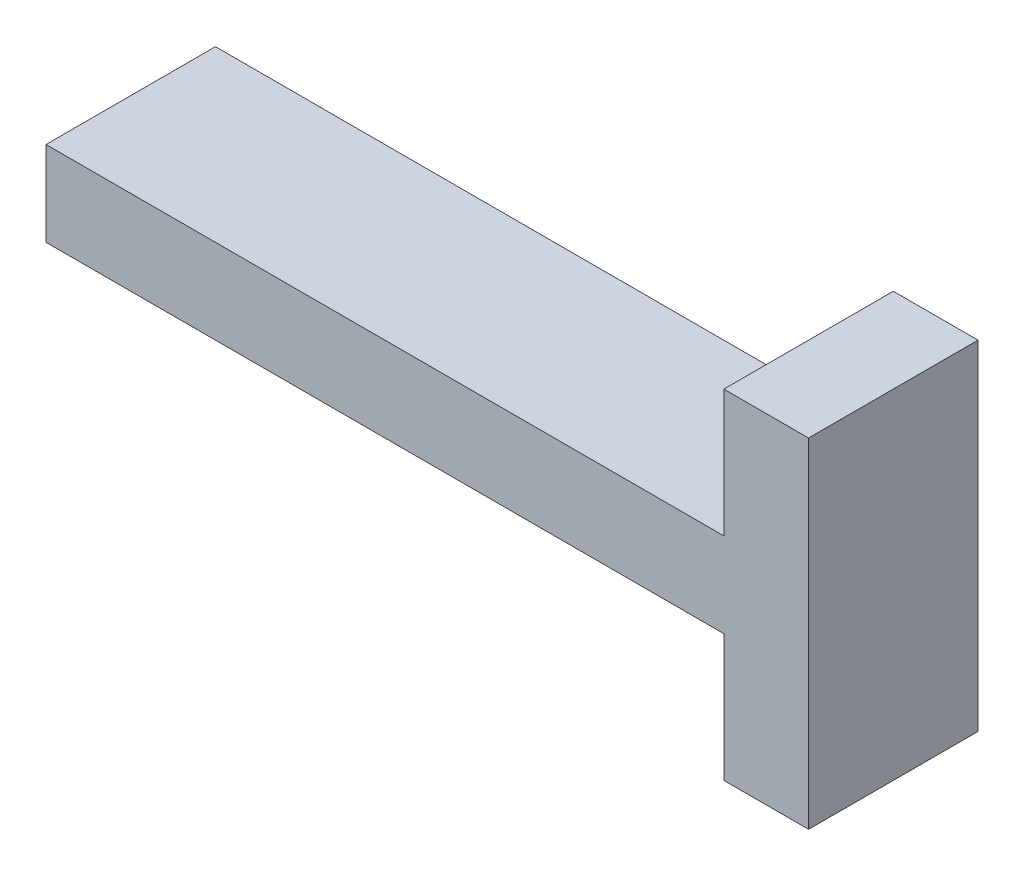
ISO-10303-21;
HEADER;
FILE_DESCRIPTION(('STEP AP214'),'2;1');
FILE_NAME('part.step','',(''),(''),'','','');
FILE_SCHEMA(('AUTOMOTIVE_DESIGN { 1 0 10303 214 1 1 1 1 }'));
ENDSEC;
DATA;
#1=APPLICATION_CONTEXT('core data for automotive mechanical design processes');
#2=APPLICATION_PROTOCOL_DEFINITION('international standard','automotive_design',2000,#1);
#3=PRODUCT_CONTEXT('',#1,'mechanical');
#4=PRODUCT('Part','Part','',(#3));
#5=PRODUCT_RELATED_PRODUCT_CATEGORY('part','',(#4));
#6=PRODUCT_DEFINITION_FORMATION('','',#4);
#7=PRODUCT_DEFINITION_CONTEXT('part definition',#1,'design');
#8=PRODUCT_DEFINITION('design','',#6,#7);
#9=PRODUCT_DEFINITION_SHAPE('','',#8);
#10=(LENGTH_UNIT() NAMED_UNIT(*) SI_UNIT(.MILLI.,.METRE.));
#11=(NAMED_UNIT(*) PLANE_ANGLE_UNIT() SI_UNIT($,.RADIAN.));
#12=(NAMED_UNIT(*) SI_UNIT($,.STERADIAN.) SOLID_ANGLE_UNIT());
#13=UNCERTAINTY_MEASURE_WITH_UNIT(LENGTH_MEASURE(1.E-05),#10,'distance_accuracy_value','');
#14=(GEOMETRIC_REPRESENTATION_CONTEXT(3) GLOBAL_UNCERTAINTY_ASSIGNED_CONTEXT((#13)) GLOBAL_UNIT_ASSIGNED_CONTEXT((#10,
#11,#12)) REPRESENTATION_CONTEXT('',''));
#15=CARTESIAN_POINT('',(0.,0.,0.));
#16=DIRECTION('',(0.,0.,1.));
#17=DIRECTION('',(1.,0.,0.));
#18=AXIS2_PLACEMENT_3D('',#15,#16,#17);
#19=CARTESIAN_POINT('',(-71.5892420537897,33.2885085574572,20.));
#20=DIRECTION('',(0.,-1.,0.));
#21=DIRECTION('',(1.,0.,0.));
#22=AXIS2_PLACEMENT_3D('',#19,#20,#21);
#23=PLANE('',#22);
#24=DIRECTION('',(-1.,0.,0.));
#25=VECTOR('',#24,1.);
#26=CARTESIAN_POINT('',(-71.5892420537897,33.2885085574572,0.));
#27=LINE('',#26,#25);
#28=CARTESIAN_POINT('',(-61.5892420537896,33.2885085574572,0.));
#29=VERTEX_POINT('',#28);
#30=CARTESIAN_POINT('',(-71.5892420537897,33.2885085574572,0.));
#31=VERTEX_POINT('',#30);
#32=EDGE_CURVE('E150',#29,#31,#27,.T.);
#33=ORIENTED_EDGE('',*,*,#32,.T.);
#34=DIRECTION('',(0.,0.,-1.));
#35=VECTOR('',#34,1.);
#36=CARTESIAN_POINT('',(-71.5892420537897,33.2885085574572,20.));
#37=LINE('',#36,#35);
#38=CARTESIAN_POINT('',(-71.5892420537897,33.2885085574572,20.));
#39=VERTEX_POINT('',#38);
#40=EDGE_CURVE('E12',#39,#31,#37,.T.);
#41=ORIENTED_EDGE('',*,*,#40,.F.);
#42=DIRECTION('',(-1.,0.,0.));
#43=VECTOR('',#42,1.);
#44=CARTESIAN_POINT('',(-71.5892420537897,33.2885085574572,20.));
#45=LINE('',#44,#43);
#46=CARTESIAN_POINT('',(-61.5892420537896,33.2885085574572,20.));
#47=VERTEX_POINT('',#46);
#48=EDGE_CURVE('E196',#47,#39,#45,.T.);
#49=ORIENTED_EDGE('',*,*,#48,.F.);
#50=DIRECTION('',(0.,0.,-1.));
#51=VECTOR('',#50,1.);
#52=CARTESIAN_POINT('',(-61.5892420537896,33.2885085574572,20.));
#53=LINE('',#52,#51);
#54=EDGE_CURVE('E145',#47,#29,#53,.T.);
#55=ORIENTED_EDGE('',*,*,#54,.T.);
#56=EDGE_LOOP('',(#33,#41,#49,#55));
#57=FACE_BOUND('',#56,.T.);
#58=ADVANCED_FACE('F48',(#57),#23,.F.);
#59=CARTESIAN_POINT('',(-71.5892420537897,18.2885085574572,20.));
#60=DIRECTION('',(1.,0.,0.));
#61=DIRECTION('',(0.,0.,-1.));
#62=AXIS2_PLACEMENT_3D('',#59,#60,#61);
#63=PLANE('',#62);
#64=DIRECTION('',(0.,-1.,0.));
#65=VECTOR('',#64,1.);
#66=CARTESIAN_POINT('',(-71.5892420537897,18.2885085574572,0.));
#67=LINE('',#66,#65);
#68=CARTESIAN_POINT('',(-71.5892420537897,18.2885085574572,0.));
#69=VERTEX_POINT('',#68);
#70=EDGE_CURVE('E177',#31,#69,#67,.T.);
#71=ORIENTED_EDGE('',*,*,#70,.T.);
#72=DIRECTION('',(0.,0.,-1.));
#73=VECTOR('',#72,1.);
#74=CARTESIAN_POINT('',(-71.5892420537897,18.2885085574572,20.));
#75=LINE('',#74,#73);
#76=CARTESIAN_POINT('',(-71.5892420537897,18.2885085574572,20.));
#77=VERTEX_POINT('',#76);
#78=EDGE_CURVE('E57',#77,#69,#75,.T.);
#79=ORIENTED_EDGE('',*,*,#78,.F.);
#80=DIRECTION('',(0.,-1.,0.));
#81=VECTOR('',#80,1.);
#82=CARTESIAN_POINT('',(-71.5892420537897,18.2885085574572,20.));
#83=LINE('',#82,#81);
#84=EDGE_CURVE('E108',#39,#77,#83,.T.);
#85=ORIENTED_EDGE('',*,*,#84,.F.);
#86=ORIENTED_EDGE('',*,*,#40,.T.);
#87=EDGE_LOOP('',(#71,#79,#85,#86));
#88=FACE_BOUND('',#87,.T.);
#89=ADVANCED_FACE('F214',(#88),#63,.F.);
#90=CARTESIAN_POINT('',(-151.58924205379,18.2885085574572,20.));
#91=DIRECTION('',(0.,-1.,0.));
#92=DIRECTION('',(0.,0.,-1.));
#93=AXIS2_PLACEMENT_3D('',#90,#91,#92);
#94=PLANE('',#93);
#95=DIRECTION('',(-1.,0.,0.));
#96=VECTOR('',#95,1.);
#97=CARTESIAN_POINT('',(-151.58924205379,18.2885085574572,0.));
#98=LINE('',#97,#96);
#99=CARTESIAN_POINT('',(-151.58924205379,18.2885085574572,0.));
#100=VERTEX_POINT('',#99);
#101=EDGE_CURVE('E171',#69,#100,#98,.T.);
#102=ORIENTED_EDGE('',*,*,#101,.T.);
#103=DIRECTION('',(0.,0.,-1.));
#104=VECTOR('',#103,1.);
#105=CARTESIAN_POINT('',(-151.58924205379,18.2885085574572,20.));
#106=LINE('',#105,#104);
#107=CARTESIAN_POINT('',(-151.58924205379,18.2885085574572,20.));
#108=VERTEX_POINT('',#107);
#109=EDGE_CURVE('E157',#108,#100,#106,.T.);
#110=ORIENTED_EDGE('',*,*,#109,.F.);
#111=DIRECTION('',(-1.,0.,0.));
#112=VECTOR('',#111,1.);
#113=CARTESIAN_POINT('',(-151.58924205379,18.2885085574572,20.));
#114=LINE('',#113,#112);
#115=EDGE_CURVE('E172',#77,#108,#114,.T.);
#116=ORIENTED_EDGE('',*,*,#115,.F.);
#117=ORIENTED_EDGE('',*,*,#78,.T.);
#118=EDGE_LOOP('',(#102,#110,#116,#117));
#119=FACE_BOUND('',#118,.T.);
#120=ADVANCED_FACE('F169',(#119),#94,.F.);
#121=CARTESIAN_POINT('',(-151.58924205379,8.28850855745723,20.));
#122=DIRECTION('',(1.,0.,0.));
#123=DIRECTION('',(0.,1.,0.));
#124=AXIS2_PLACEMENT_3D('',#121,#122,#123);
#125=PLANE('',#124);
#126=DIRECTION('',(0.,-1.,0.));
#127=VECTOR('',#126,1.);
#128=CARTESIAN_POINT('',(-151.58924205379,8.28850855745723,0.));
#129=LINE('',#128,#127);
#130=CARTESIAN_POINT('',(-151.58924205379,8.28850855745723,0.));
#131=VERTEX_POINT('',#130);
#132=EDGE_CURVE('E179',#100,#131,#129,.T.);
#133=ORIENTED_EDGE('',*,*,#132,.T.);
#134=DIRECTION('',(0.,0.,-1.));
#135=VECTOR('',#134,1.);
#136=CARTESIAN_POINT('',(-151.58924205379,8.28850855745723,20.));
#137=LINE('',#136,#135);
#138=CARTESIAN_POINT('',(-151.58924205379,8.28850855745723,20.));
#139=VERTEX_POINT('',#138);
#140=EDGE_CURVE('E162',#139,#131,#137,.T.);
#141=ORIENTED_EDGE('',*,*,#140,.F.);
#142=DIRECTION('',(0.,-1.,0.));
#143=VECTOR('',#142,1.);
#144=CARTESIAN_POINT('',(-151.58924205379,8.28850855745723,20.));
#145=LINE('',#144,#143);
#146=EDGE_CURVE('E203',#108,#139,#145,.T.);
#147=ORIENTED_EDGE('',*,*,#146,.F.);
#148=ORIENTED_EDGE('',*,*,#109,.T.);
#149=EDGE_LOOP('',(#133,#141,#147,#148));
#150=FACE_BOUND('',#149,.T.);
#151=ADVANCED_FACE('F220',(#150),#125,.F.);
#152=CARTESIAN_POINT('',(-71.5892420537898,8.28850855745724,20.));
#153=DIRECTION('',(0.,1.,0.));
#154=DIRECTION('',(-1.,0.,0.));
#155=AXIS2_PLACEMENT_3D('',#152,#153,#154);
#156=PLANE('',#155);
#157=DIRECTION('',(1.,0.,0.));
#158=VECTOR('',#157,1.);
#159=CARTESIAN_POINT('',(-71.5892420537898,8.28850855745724,0.));
#160=LINE('',#159,#158);
#161=CARTESIAN_POINT('',(-71.5892420537898,8.28850855745724,0.));
#162=VERTEX_POINT('',#161);
#163=EDGE_CURVE('E183',#131,#162,#160,.T.);
#164=ORIENTED_EDGE('',*,*,#163,.T.);
#165=DIRECTION('',(0.,0.,-1.));
#166=VECTOR('',#165,1.);
#167=CARTESIAN_POINT('',(-71.5892420537898,8.28850855745724,20.));
#168=LINE('',#167,#166);
#169=CARTESIAN_POINT('',(-71.5892420537898,8.28850855745724,20.));
#170=VERTEX_POINT('',#169);
#171=EDGE_CURVE('E138',#170,#162,#168,.T.);
#172=ORIENTED_EDGE('',*,*,#171,.F.);
#173=DIRECTION('',(1.,0.,0.));
#174=VECTOR('',#173,1.);
#175=CARTESIAN_POINT('',(-71.5892420537898,8.28850855745724,20.));
#176=LINE('',#175,#174);
#177=EDGE_CURVE('E127',#139,#170,#176,.T.);
#178=ORIENTED_EDGE('',*,*,#177,.F.);
#179=ORIENTED_EDGE('',*,*,#140,.T.);
#180=EDGE_LOOP('',(#164,#172,#178,#179));
#181=FACE_BOUND('',#180,.T.);
#182=ADVANCED_FACE('F225',(#181),#156,.F.);
#183=CARTESIAN_POINT('',(-71.5892420537898,-6.71149144254276,20.));
#184=DIRECTION('',(1.,0.,0.));
#185=DIRECTION('',(0.,0.,-1.));
#186=AXIS2_PLACEMENT_3D('',#183,#184,#185);
#187=PLANE('',#186);
#188=DIRECTION('',(0.,-1.,0.));
#189=VECTOR('',#188,1.);
#190=CARTESIAN_POINT('',(-71.5892420537898,-6.71149144254276,0.));
#191=LINE('',#190,#189);
#192=CARTESIAN_POINT('',(-71.5892420537898,-6.71149144254276,0.));
#193=VERTEX_POINT('',#192);
#194=EDGE_CURVE('E136',#162,#193,#191,.T.);
#195=ORIENTED_EDGE('',*,*,#194,.T.);
#196=DIRECTION('',(0.,0.,-1.));
#197=VECTOR('',#196,1.);
#198=CARTESIAN_POINT('',(-71.5892420537898,-6.71149144254276,20.));
#199=LINE('',#198,#197);
#200=CARTESIAN_POINT('',(-71.5892420537898,-6.71149144254276,20.));
#201=VERTEX_POINT('',#200);
#202=EDGE_CURVE('E133',#201,#193,#199,.T.);
#203=ORIENTED_EDGE('',*,*,#202,.F.);
#204=DIRECTION('',(0.,-1.,0.));
#205=VECTOR('',#204,1.);
#206=CARTESIAN_POINT('',(-71.5892420537898,-6.71149144254276,20.));
#207=LINE('',#206,#205);
#208=EDGE_CURVE('E121',#170,#201,#207,.T.);
#209=ORIENTED_EDGE('',*,*,#208,.F.);
#210=ORIENTED_EDGE('',*,*,#171,.T.);
#211=EDGE_LOOP('',(#195,#203,#209,#210));
#212=FACE_BOUND('',#211,.T.);
#213=ADVANCED_FACE('F134',(#212),#187,.F.);
#214=CARTESIAN_POINT('',(-61.5892420537896,-6.71149144254276,20.));
#215=DIRECTION('',(0.,1.,0.));
#216=DIRECTION('',(-1.,0.,0.));
#217=AXIS2_PLACEMENT_3D('',#214,#215,#216);
#218=PLANE('',#217);
#219=DIRECTION('',(1.,0.,0.));
#220=VECTOR('',#219,1.);
#221=CARTESIAN_POINT('',(-61.5892420537896,-6.71149144254276,0.));
#222=LINE('',#221,#220);
#223=CARTESIAN_POINT('',(-61.5892420537896,-6.71149144254276,0.));
#224=VERTEX_POINT('',#223);
#225=EDGE_CURVE('E94',#193,#224,#222,.T.);
#226=ORIENTED_EDGE('',*,*,#225,.T.);
#227=DIRECTION('',(0.,0.,-1.));
#228=VECTOR('',#227,1.);
#229=CARTESIAN_POINT('',(-61.5892420537896,-6.71149144254276,20.));
#230=LINE('',#229,#228);
#231=CARTESIAN_POINT('',(-61.5892420537896,-6.71149144254276,20.));
#232=VERTEX_POINT('',#231);
#233=EDGE_CURVE('E139',#232,#224,#230,.T.);
#234=ORIENTED_EDGE('',*,*,#233,.F.);
#235=DIRECTION('',(1.,0.,0.));
#236=VECTOR('',#235,1.);
#237=CARTESIAN_POINT('',(-61.5892420537896,-6.71149144254276,20.));
#238=LINE('',#237,#236);
#239=EDGE_CURVE('E125',#201,#232,#238,.T.);
#240=ORIENTED_EDGE('',*,*,#239,.F.);
#241=ORIENTED_EDGE('',*,*,#202,.T.);
#242=EDGE_LOOP('',(#226,#234,#240,#241));
#243=FACE_BOUND('',#242,.T.);
#244=ADVANCED_FACE('F141',(#243),#218,.F.);
#245=CARTESIAN_POINT('',(-61.5892420537896,33.2885085574572,20.));
#246=DIRECTION('',(-1.,0.,0.));
#247=DIRECTION('',(0.,-1.,0.));
#248=AXIS2_PLACEMENT_3D('',#245,#246,#247);
#249=PLANE('',#248);
#250=DIRECTION('',(0.,1.,0.));
#251=VECTOR('',#250,1.);
#252=CARTESIAN_POINT('',(-61.5892420537896,33.2885085574572,0.));
#253=LINE('',#252,#251);
#254=EDGE_CURVE('E100',#224,#29,#253,.T.);
#255=ORIENTED_EDGE('',*,*,#254,.T.);
#256=ORIENTED_EDGE('',*,*,#54,.F.);
#257=DIRECTION('',(0.,1.,0.));
#258=VECTOR('',#257,1.);
#259=CARTESIAN_POINT('',(-61.5892420537896,33.2885085574572,20.));
#260=LINE('',#259,#258);
#261=EDGE_CURVE('E65',#232,#47,#260,.T.);
#262=ORIENTED_EDGE('',*,*,#261,.F.);
#263=ORIENTED_EDGE('',*,*,#233,.T.);
#264=EDGE_LOOP('',(#255,#256,#262,#263));
#265=FACE_BOUND('',#264,.T.);
#266=ADVANCED_FACE('F234',(#265),#249,.F.);
#267=CARTESIAN_POINT('',(0.,0.,20.));
#268=DIRECTION('',(0.,0.,-1.));
#269=DIRECTION('',(-1.,0.,0.));
#270=AXIS2_PLACEMENT_3D('',#267,#268,#269);
#271=PLANE('',#270);
#272=ORIENTED_EDGE('',*,*,#48,.T.);
#273=ORIENTED_EDGE('',*,*,#84,.T.);
#274=ORIENTED_EDGE('',*,*,#115,.T.);
#275=ORIENTED_EDGE('',*,*,#146,.T.);
#276=ORIENTED_EDGE('',*,*,#177,.T.);
#277=ORIENTED_EDGE('',*,*,#208,.T.);
#278=ORIENTED_EDGE('',*,*,#239,.T.);
#279=ORIENTED_EDGE('',*,*,#261,.T.);
#280=EDGE_LOOP('',(#272,#273,#274,#275,#276,#277,#278,#279));
#281=FACE_BOUND('',#280,.T.);
#282=ADVANCED_FACE('F123',(#281),#271,.F.);
#283=CARTESIAN_POINT('',(0.,0.,0.));
#284=DIRECTION('',(0.,0.,-1.));
#285=DIRECTION('',(-1.,0.,0.));
#286=AXIS2_PLACEMENT_3D('',#283,#284,#285);
#287=PLANE('',#286);
#288=ORIENTED_EDGE('',*,*,#32,.F.);
#289=ORIENTED_EDGE('',*,*,#254,.F.);
#290=ORIENTED_EDGE('',*,*,#225,.F.);
#291=ORIENTED_EDGE('',*,*,#194,.F.);
#292=ORIENTED_EDGE('',*,*,#163,.F.);
#293=ORIENTED_EDGE('',*,*,#132,.F.);
#294=ORIENTED_EDGE('',*,*,#101,.F.);
#295=ORIENTED_EDGE('',*,*,#70,.F.);
#296=EDGE_LOOP('',(#288,#289,#290,#291,#292,#293,#294,#295));
#297=FACE_BOUND('',#296,.T.);
#298=ADVANCED_FACE('F176',(#297),#287,.T.);
#299=CLOSED_SHELL('',(#58,#89,#120,#151,#182,#213,#244,#266,#282,#298));
#300=MANIFOLD_SOLID_BREP('B2',#299);
#301=ADVANCED_BREP_SHAPE_REPRESENTATION('',(#18,#300),#14);
#302=SHAPE_DEFINITION_REPRESENTATION(#9,#301);
ENDSEC;
END-ISO-10303-21;
